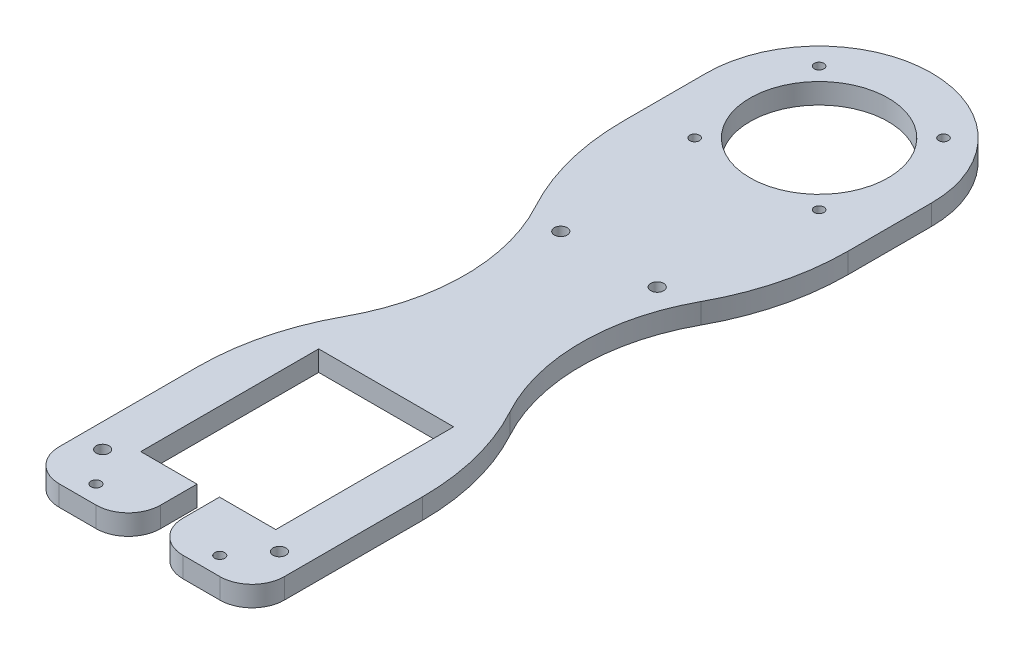
ISO-10303-21;
HEADER;
FILE_DESCRIPTION(('STEP AP214'),'2;1');
FILE_NAME('part.step','',(''),(''),'','','');
FILE_SCHEMA(('AUTOMOTIVE_DESIGN { 1 0 10303 214 1 1 1 1 }'));
ENDSEC;
DATA;
#1=APPLICATION_CONTEXT('core data for automotive mechanical design processes');
#2=APPLICATION_PROTOCOL_DEFINITION('international standard','automotive_design',2000,#1);
#3=PRODUCT_CONTEXT('',#1,'mechanical');
#4=PRODUCT('Part','Part','',(#3));
#5=PRODUCT_RELATED_PRODUCT_CATEGORY('part','',(#4));
#6=PRODUCT_DEFINITION_FORMATION('','',#4);
#7=PRODUCT_DEFINITION_CONTEXT('part definition',#1,'design');
#8=PRODUCT_DEFINITION('design','',#6,#7);
#9=PRODUCT_DEFINITION_SHAPE('','',#8);
#10=(LENGTH_UNIT() NAMED_UNIT(*) SI_UNIT(.MILLI.,.METRE.));
#11=(NAMED_UNIT(*) PLANE_ANGLE_UNIT() SI_UNIT($,.RADIAN.));
#12=(NAMED_UNIT(*) SI_UNIT($,.STERADIAN.) SOLID_ANGLE_UNIT());
#13=UNCERTAINTY_MEASURE_WITH_UNIT(LENGTH_MEASURE(1.E-05),#10,'distance_accuracy_value','');
#14=(GEOMETRIC_REPRESENTATION_CONTEXT(3) GLOBAL_UNCERTAINTY_ASSIGNED_CONTEXT((#13)) GLOBAL_UNIT_ASSIGNED_CONTEXT((#10,
#11,#12)) REPRESENTATION_CONTEXT('',''));
#15=CARTESIAN_POINT('',(0.,0.,0.));
#16=DIRECTION('',(0.,0.,1.));
#17=DIRECTION('',(1.,0.,0.));
#18=AXIS2_PLACEMENT_3D('',#15,#16,#17);
#19=CARTESIAN_POINT('',(35.,3.175,0.));
#20=DIRECTION('',(-1.,0.,0.));
#21=DIRECTION('',(0.,0.,1.));
#22=AXIS2_PLACEMENT_3D('',#19,#20,#21);
#23=PLANE('',#22);
#24=DIRECTION('',(0.,0.,-1.));
#25=VECTOR('',#24,1.);
#26=CARTESIAN_POINT('',(35.,3.175,0.));
#27=LINE('',#26,#25);
#28=CARTESIAN_POINT('',(35.,3.175,26.0091806341473));
#29=VERTEX_POINT('',#28);
#30=CARTESIAN_POINT('',(35.,3.175,0.));
#31=VERTEX_POINT('',#30);
#32=EDGE_CURVE('E316',#29,#31,#27,.T.);
#33=ORIENTED_EDGE('',*,*,#32,.F.);
#34=DIRECTION('',(0.,1.,0.));
#35=VECTOR('',#34,1.);
#36=CARTESIAN_POINT('',(35.,-3.175,26.0091806341473));
#37=LINE('',#36,#35);
#38=CARTESIAN_POINT('',(35.,-3.175,26.0091806341473));
#39=VERTEX_POINT('',#38);
#40=EDGE_CURVE('E395',#29,#39,#37,.F.);
#41=ORIENTED_EDGE('',*,*,#40,.T.);
#42=DIRECTION('',(0.,0.,-1.));
#43=VECTOR('',#42,1.);
#44=CARTESIAN_POINT('',(35.,-3.175,0.));
#45=LINE('',#44,#43);
#46=CARTESIAN_POINT('',(35.,-3.175,0.));
#47=VERTEX_POINT('',#46);
#48=EDGE_CURVE('E333',#39,#47,#45,.T.);
#49=ORIENTED_EDGE('',*,*,#48,.T.);
#50=DIRECTION('',(0.,-1.,0.));
#51=VECTOR('',#50,1.);
#52=CARTESIAN_POINT('',(35.,3.175,0.));
#53=LINE('',#52,#51);
#54=EDGE_CURVE('E315',#31,#47,#53,.T.);
#55=ORIENTED_EDGE('',*,*,#54,.F.);
#56=EDGE_LOOP('',(#33,#41,#49,#55));
#57=FACE_BOUND('',#56,.T.);
#58=ADVANCED_FACE('F41',(#57),#23,.F.);
#59=CARTESIAN_POINT('',(35.,-3.175,201.35));
#60=VERTEX_POINT('',#59);
#61=CARTESIAN_POINT('',(35.,-3.175,158.290819365853));
#62=VERTEX_POINT('',#61);
#63=EDGE_CURVE('E301',#60,#62,#45,.T.);
#64=ORIENTED_EDGE('',*,*,#63,.T.);
#65=DIRECTION('',(0.,1.,0.));
#66=VECTOR('',#65,1.);
#67=CARTESIAN_POINT('',(35.,3.175,158.290819365853));
#68=LINE('',#67,#66);
#69=CARTESIAN_POINT('',(35.,3.175,158.290819365853));
#70=VERTEX_POINT('',#69);
#71=EDGE_CURVE('E429',#62,#70,#68,.T.);
#72=ORIENTED_EDGE('',*,*,#71,.T.);
#73=CARTESIAN_POINT('',(35.,3.175,201.35));
#74=VERTEX_POINT('',#73);
#75=EDGE_CURVE('E311',#74,#70,#27,.T.);
#76=ORIENTED_EDGE('',*,*,#75,.F.);
#77=DIRECTION('',(0.,-1.,0.));
#78=VECTOR('',#77,1.);
#79=CARTESIAN_POINT('',(35.,3.175,201.35));
#80=LINE('',#79,#78);
#81=EDGE_CURVE('E391',#74,#60,#80,.T.);
#82=ORIENTED_EDGE('',*,*,#81,.T.);
#83=EDGE_LOOP('',(#64,#72,#76,#82));
#84=FACE_BOUND('',#83,.T.);
#85=ADVANCED_FACE('F532',(#84),#23,.F.);
#86=CARTESIAN_POINT('',(0.,3.175,0.));
#87=DIRECTION('',(0.,1.,0.));
#88=DIRECTION('',(0.,0.,1.));
#89=AXIS2_PLACEMENT_3D('',#86,#87,#88);
#90=PLANE('',#89);
#91=CARTESIAN_POINT('',(-19.25,3.175,205.675));
#92=DIRECTION('',(0.,-1.,0.));
#93=DIRECTION('',(0.,0.,-1.));
#94=AXIS2_PLACEMENT_3D('',#91,#92,#93);
#95=CIRCLE('',#94,1.55);
#96=CARTESIAN_POINT('',(-19.25,3.175,204.125));
#97=VERTEX_POINT('',#96);
#98=EDGE_CURVE('E660',#97,#97,#95,.T.);
#99=ORIENTED_EDGE('',*,*,#98,.T.);
#100=EDGE_LOOP('',(#99));
#101=FACE_BOUND('',#100,.T.);
#102=CARTESIAN_POINT('',(19.25,3.175,205.675));
#103=DIRECTION('',(0.,-1.,0.));
#104=DIRECTION('',(0.,0.,-1.));
#105=AXIS2_PLACEMENT_3D('',#102,#103,#104);
#106=CIRCLE('',#105,1.55);
#107=CARTESIAN_POINT('',(19.25,3.175,204.125));
#108=VERTEX_POINT('',#107);
#109=EDGE_CURVE('E670',#108,#108,#106,.T.);
#110=ORIENTED_EDGE('',*,*,#109,.T.);
#111=EDGE_LOOP('',(#110));
#112=FACE_BOUND('',#111,.T.);
#113=CARTESIAN_POINT('',(27.5,3.175,195.35));
#114=DIRECTION('',(0.,1.,0.));
#115=DIRECTION('',(0.,0.,1.));
#116=AXIS2_PLACEMENT_3D('',#113,#114,#115);
#117=CIRCLE('',#116,2.00000000000001);
#118=CARTESIAN_POINT('',(27.5,3.175,197.35));
#119=VERTEX_POINT('',#118);
#120=EDGE_CURVE('E459',#119,#119,#117,.T.);
#121=ORIENTED_EDGE('',*,*,#120,.F.);
#122=EDGE_LOOP('',(#121));
#123=FACE_BOUND('',#122,.T.);
#124=CARTESIAN_POINT('',(-27.5,3.175,195.35));
#125=DIRECTION('',(0.,1.,0.));
#126=DIRECTION('',(0.,0.,1.));
#127=AXIS2_PLACEMENT_3D('',#124,#125,#126);
#128=CIRCLE('',#127,2.00000000000001);
#129=CARTESIAN_POINT('',(-27.5,3.175,197.35));
#130=VERTEX_POINT('',#129);
#131=EDGE_CURVE('E479',#130,#130,#128,.T.);
#132=ORIENTED_EDGE('',*,*,#131,.F.);
#133=EDGE_LOOP('',(#132));
#134=FACE_BOUND('',#133,.T.);
#135=CARTESIAN_POINT('',(15.,3.175,65.35));
#136=DIRECTION('',(0.,1.,0.));
#137=DIRECTION('',(0.,0.,1.));
#138=AXIS2_PLACEMENT_3D('',#135,#136,#137);
#139=CIRCLE('',#138,2.00000000000001);
#140=CARTESIAN_POINT('',(15.,3.175,67.35));
#141=VERTEX_POINT('',#140);
#142=EDGE_CURVE('E471',#141,#141,#139,.T.);
#143=ORIENTED_EDGE('',*,*,#142,.F.);
#144=EDGE_LOOP('',(#143));
#145=FACE_BOUND('',#144,.T.);
#146=CARTESIAN_POINT('',(-15.,3.175,65.35));
#147=DIRECTION('',(0.,1.,0.));
#148=DIRECTION('',(0.,0.,1.));
#149=AXIS2_PLACEMENT_3D('',#146,#147,#148);
#150=CIRCLE('',#149,2.00000000000001);
#151=CARTESIAN_POINT('',(-15.,3.175,67.35));
#152=VERTEX_POINT('',#151);
#153=EDGE_CURVE('E470',#152,#152,#150,.T.);
#154=ORIENTED_EDGE('',*,*,#153,.F.);
#155=EDGE_LOOP('',(#154));
#156=FACE_BOUND('',#155,.T.);
#157=CARTESIAN_POINT('',(-19.35,3.175,19.35));
#158=DIRECTION('',(0.,1.,0.));
#159=DIRECTION('',(0.,0.,1.));
#160=AXIS2_PLACEMENT_3D('',#157,#158,#159);
#161=CIRCLE('',#160,1.5);
#162=CARTESIAN_POINT('',(-19.35,3.175,20.85));
#163=VERTEX_POINT('',#162);
#164=EDGE_CURVE('E494',#163,#163,#161,.T.);
#165=ORIENTED_EDGE('',*,*,#164,.F.);
#166=EDGE_LOOP('',(#165));
#167=FACE_BOUND('',#166,.T.);
#168=CARTESIAN_POINT('',(19.35,3.175,19.35));
#169=DIRECTION('',(0.,1.,0.));
#170=DIRECTION('',(0.,0.,1.));
#171=AXIS2_PLACEMENT_3D('',#168,#169,#170);
#172=CIRCLE('',#171,1.5);
#173=CARTESIAN_POINT('',(19.35,3.175,20.85));
#174=VERTEX_POINT('',#173);
#175=EDGE_CURVE('E510',#174,#174,#172,.T.);
#176=ORIENTED_EDGE('',*,*,#175,.F.);
#177=EDGE_LOOP('',(#176));
#178=FACE_BOUND('',#177,.T.);
#179=CARTESIAN_POINT('',(19.35,3.175,-19.35));
#180=DIRECTION('',(0.,1.,0.));
#181=DIRECTION('',(0.,0.,1.));
#182=AXIS2_PLACEMENT_3D('',#179,#180,#181);
#183=CIRCLE('',#182,1.5);
#184=CARTESIAN_POINT('',(19.35,3.175,-17.85));
#185=VERTEX_POINT('',#184);
#186=EDGE_CURVE('E502',#185,#185,#183,.T.);
#187=ORIENTED_EDGE('',*,*,#186,.F.);
#188=EDGE_LOOP('',(#187));
#189=FACE_BOUND('',#188,.T.);
#190=CARTESIAN_POINT('',(-19.35,3.175,-19.35));
#191=DIRECTION('',(0.,1.,0.));
#192=DIRECTION('',(0.,0.,1.));
#193=AXIS2_PLACEMENT_3D('',#190,#191,#192);
#194=CIRCLE('',#193,1.5);
#195=CARTESIAN_POINT('',(-19.35,3.175,-17.85));
#196=VERTEX_POINT('',#195);
#197=EDGE_CURVE('E243',#196,#196,#194,.T.);
#198=ORIENTED_EDGE('',*,*,#197,.F.);
#199=EDGE_LOOP('',(#198));
#200=FACE_BOUND('',#199,.T.);
#201=CARTESIAN_POINT('',(0.,3.175,0.));
#202=DIRECTION('',(0.,1.,0.));
#203=DIRECTION('',(0.,0.,1.));
#204=AXIS2_PLACEMENT_3D('',#201,#202,#203);
#205=CIRCLE('',#204,21.5);
#206=CARTESIAN_POINT('',(0.,3.175,21.5));
#207=VERTEX_POINT('',#206);
#208=EDGE_CURVE('E275',#207,#207,#205,.T.);
#209=ORIENTED_EDGE('',*,*,#208,.F.);
#210=EDGE_LOOP('',(#209));
#211=FACE_BOUND('',#210,.T.);
#212=CARTESIAN_POINT('',(80.,3.175,92.15));
#213=DIRECTION('',(0.,1.,0.));
#214=DIRECTION('',(0.,0.,-1.));
#215=AXIS2_PLACEMENT_3D('',#212,#213,#214);
#216=CIRCLE('',#215,61.8970920156997);
#217=CARTESIAN_POINT('',(25.6874106304796,3.175,62.4617424563539));
#218=VERTEX_POINT('',#217);
#219=CARTESIAN_POINT('',(25.6874106304796,3.175,121.838257543646));
#220=VERTEX_POINT('',#219);
#221=EDGE_CURVE('E455',#218,#220,#216,.T.);
#222=ORIENTED_EDGE('',*,*,#221,.F.);
#223=CARTESIAN_POINT('',(-41.,3.175,26.0091806341473));
#224=DIRECTION('',(0.,1.,0.));
#225=DIRECTION('',(0.,0.,1.));
#226=AXIS2_PLACEMENT_3D('',#223,#224,#225);
#227=CIRCLE('',#226,76.);
#228=EDGE_CURVE('E426',#218,#29,#227,.T.);
#229=ORIENTED_EDGE('',*,*,#228,.T.);
#230=ORIENTED_EDGE('',*,*,#32,.T.);
#231=CARTESIAN_POINT('',(0.,3.175,0.));
#232=DIRECTION('',(0.,1.,0.));
#233=DIRECTION('',(0.,0.,1.));
#234=AXIS2_PLACEMENT_3D('',#231,#232,#233);
#235=CIRCLE('',#234,35.);
#236=CARTESIAN_POINT('',(-35.,3.175,0.));
#237=VERTEX_POINT('',#236);
#238=EDGE_CURVE('E296',#31,#237,#235,.T.);
#239=ORIENTED_EDGE('',*,*,#238,.T.);
#240=DIRECTION('',(0.,0.,1.));
#241=VECTOR('',#240,1.);
#242=CARTESIAN_POINT('',(-35.,3.175,0.));
#243=LINE('',#242,#241);
#244=CARTESIAN_POINT('',(-35.,3.175,26.0091806341473));
#245=VERTEX_POINT('',#244);
#246=EDGE_CURVE('E302',#237,#245,#243,.T.);
#247=ORIENTED_EDGE('',*,*,#246,.T.);
#248=CARTESIAN_POINT('',(41.,3.175,26.0091806341473));
#249=DIRECTION('',(0.,1.,0.));
#250=DIRECTION('',(0.,0.,1.));
#251=AXIS2_PLACEMENT_3D('',#248,#249,#250);
#252=CIRCLE('',#251,76.);
#253=CARTESIAN_POINT('',(-25.6874106304796,3.175,62.4617424563539));
#254=VERTEX_POINT('',#253);
#255=EDGE_CURVE('E420',#245,#254,#252,.T.);
#256=ORIENTED_EDGE('',*,*,#255,.T.);
#257=CARTESIAN_POINT('',(-80.,3.175,92.15));
#258=DIRECTION('',(0.,-1.,0.));
#259=DIRECTION('',(0.,0.,-1.));
#260=AXIS2_PLACEMENT_3D('',#257,#258,#259);
#261=CIRCLE('',#260,61.8970920156997);
#262=CARTESIAN_POINT('',(-25.6874106304796,3.175,121.838257543646));
#263=VERTEX_POINT('',#262);
#264=EDGE_CURVE('E452',#254,#263,#261,.T.);
#265=ORIENTED_EDGE('',*,*,#264,.T.);
#266=CARTESIAN_POINT('',(41.,3.175,158.290819365853));
#267=DIRECTION('',(0.,1.,0.));
#268=DIRECTION('',(0.,0.,1.));
#269=AXIS2_PLACEMENT_3D('',#266,#267,#268);
#270=CIRCLE('',#269,76.);
#271=CARTESIAN_POINT('',(-35.,3.175,158.290819365853));
#272=VERTEX_POINT('',#271);
#273=EDGE_CURVE('E57',#263,#272,#270,.T.);
#274=ORIENTED_EDGE('',*,*,#273,.T.);
#275=CARTESIAN_POINT('',(-35.,3.175,201.35));
#276=VERTEX_POINT('',#275);
#277=EDGE_CURVE('E300',#272,#276,#243,.T.);
#278=ORIENTED_EDGE('',*,*,#277,.T.);
#279=CARTESIAN_POINT('',(-25.,3.175,201.35));
#280=DIRECTION('',(0.,1.,0.));
#281=DIRECTION('',(0.,0.,1.));
#282=AXIS2_PLACEMENT_3D('',#279,#280,#281);
#283=CIRCLE('',#282,10.);
#284=CARTESIAN_POINT('',(-25.,3.175,211.35));
#285=VERTEX_POINT('',#284);
#286=EDGE_CURVE('E352',#276,#285,#283,.T.);
#287=ORIENTED_EDGE('',*,*,#286,.T.);
#288=DIRECTION('',(1.,0.,0.));
#289=VECTOR('',#288,1.);
#290=CARTESIAN_POINT('',(0.,3.175,211.35));
#291=LINE('',#290,#289);
#292=CARTESIAN_POINT('',(-13.5,3.175,211.35));
#293=VERTEX_POINT('',#292);
#294=EDGE_CURVE('E310',#285,#293,#291,.T.);
#295=ORIENTED_EDGE('',*,*,#294,.T.);
#296=CARTESIAN_POINT('',(-13.5,3.175,201.35));
#297=DIRECTION('',(0.,1.,0.));
#298=DIRECTION('',(0.,0.,1.));
#299=AXIS2_PLACEMENT_3D('',#296,#297,#298);
#300=CIRCLE('',#299,10.);
#301=CARTESIAN_POINT('',(-3.5,3.175,201.35));
#302=VERTEX_POINT('',#301);
#303=EDGE_CURVE('E358',#293,#302,#300,.T.);
#304=ORIENTED_EDGE('',*,*,#303,.T.);
#305=DIRECTION('',(0.,0.,-1.));
#306=VECTOR('',#305,1.);
#307=CARTESIAN_POINT('',(-3.5,3.175,0.));
#308=LINE('',#307,#306);
#309=CARTESIAN_POINT('',(-3.5,3.175,190.));
#310=VERTEX_POINT('',#309);
#311=EDGE_CURVE('E262',#302,#310,#308,.T.);
#312=ORIENTED_EDGE('',*,*,#311,.T.);
#313=DIRECTION('',(-1.,0.,0.));
#314=VECTOR('',#313,1.);
#315=CARTESIAN_POINT('',(0.,3.175,190.));
#316=LINE('',#315,#314);
#317=CARTESIAN_POINT('',(-21.,3.175,190.));
#318=VERTEX_POINT('',#317);
#319=EDGE_CURVE('E258',#310,#318,#316,.T.);
#320=ORIENTED_EDGE('',*,*,#319,.T.);
#321=DIRECTION('',(0.,0.,-1.));
#322=VECTOR('',#321,1.);
#323=CARTESIAN_POINT('',(-21.,3.175,0.));
#324=LINE('',#323,#322);
#325=CARTESIAN_POINT('',(-21.,3.175,134.65));
#326=VERTEX_POINT('',#325);
#327=EDGE_CURVE('E225',#318,#326,#324,.T.);
#328=ORIENTED_EDGE('',*,*,#327,.T.);
#329=DIRECTION('',(-1.,0.,0.));
#330=VECTOR('',#329,1.);
#331=CARTESIAN_POINT('',(0.,3.175,134.65));
#332=LINE('',#331,#330);
#333=CARTESIAN_POINT('',(21.,3.175,134.65));
#334=VERTEX_POINT('',#333);
#335=EDGE_CURVE('E236',#334,#326,#332,.T.);
#336=ORIENTED_EDGE('',*,*,#335,.F.);
#337=DIRECTION('',(0.,0.,-1.));
#338=VECTOR('',#337,1.);
#339=CARTESIAN_POINT('',(21.,3.175,0.));
#340=LINE('',#339,#338);
#341=CARTESIAN_POINT('',(21.,3.175,190.));
#342=VERTEX_POINT('',#341);
#343=EDGE_CURVE('E240',#342,#334,#340,.T.);
#344=ORIENTED_EDGE('',*,*,#343,.F.);
#345=CARTESIAN_POINT('',(3.5,3.175,190.));
#346=VERTEX_POINT('',#345);
#347=EDGE_CURVE('E263',#342,#346,#316,.T.);
#348=ORIENTED_EDGE('',*,*,#347,.T.);
#349=DIRECTION('',(0.,0.,-1.));
#350=VECTOR('',#349,1.);
#351=CARTESIAN_POINT('',(3.5,3.175,0.));
#352=LINE('',#351,#350);
#353=CARTESIAN_POINT('',(3.5,3.175,201.35));
#354=VERTEX_POINT('',#353);
#355=EDGE_CURVE('E266',#354,#346,#352,.T.);
#356=ORIENTED_EDGE('',*,*,#355,.F.);
#357=CARTESIAN_POINT('',(13.5,3.175,201.35));
#358=DIRECTION('',(0.,1.,0.));
#359=DIRECTION('',(0.,0.,1.));
#360=AXIS2_PLACEMENT_3D('',#357,#358,#359);
#361=CIRCLE('',#360,10.);
#362=CARTESIAN_POINT('',(13.5,3.175,211.35));
#363=VERTEX_POINT('',#362);
#364=EDGE_CURVE('E355',#354,#363,#361,.T.);
#365=ORIENTED_EDGE('',*,*,#364,.T.);
#366=CARTESIAN_POINT('',(25.,3.175,211.35));
#367=VERTEX_POINT('',#366);
#368=EDGE_CURVE('E306',#363,#367,#291,.T.);
#369=ORIENTED_EDGE('',*,*,#368,.T.);
#370=CARTESIAN_POINT('',(25.,3.175,201.35));
#371=DIRECTION('',(0.,1.,0.));
#372=DIRECTION('',(0.,0.,1.));
#373=AXIS2_PLACEMENT_3D('',#370,#371,#372);
#374=CIRCLE('',#373,10.);
#375=EDGE_CURVE('E349',#367,#74,#374,.T.);
#376=ORIENTED_EDGE('',*,*,#375,.T.);
#377=ORIENTED_EDGE('',*,*,#75,.T.);
#378=CARTESIAN_POINT('',(-41.,3.175,158.290819365853));
#379=DIRECTION('',(0.,1.,0.));
#380=DIRECTION('',(0.,0.,1.));
#381=AXIS2_PLACEMENT_3D('',#378,#379,#380);
#382=CIRCLE('',#381,76.);
#383=EDGE_CURVE('E423',#70,#220,#382,.T.);
#384=ORIENTED_EDGE('',*,*,#383,.T.);
#385=EDGE_LOOP('',(#222,#229,#230,#239,#247,#256,#265,#274,#278,#287,#295,#304,#312,#320,#328,
#336,#344,#348,#356,#365,#369,#376,#377,#384));
#386=FACE_BOUND('',#385,.T.);
#387=ADVANCED_FACE('F444',(#101,#112,#123,#134,#145,#156,#167,#178,#189,#200,#211,#386),#90,.T.);
#388=CARTESIAN_POINT('',(0.,-3.175,0.));
#389=DIRECTION('',(0.,1.,0.));
#390=DIRECTION('',(0.,0.,1.));
#391=AXIS2_PLACEMENT_3D('',#388,#389,#390);
#392=PLANE('',#391);
#393=CARTESIAN_POINT('',(-19.25,-3.175,205.675));
#394=DIRECTION('',(0.,-1.,0.));
#395=DIRECTION('',(0.,0.,-1.));
#396=AXIS2_PLACEMENT_3D('',#393,#394,#395);
#397=CIRCLE('',#396,1.55);
#398=CARTESIAN_POINT('',(-19.25,-3.175,204.125));
#399=VERTEX_POINT('',#398);
#400=EDGE_CURVE('E663',#399,#399,#397,.T.);
#401=ORIENTED_EDGE('',*,*,#400,.F.);
#402=EDGE_LOOP('',(#401));
#403=FACE_BOUND('',#402,.T.);
#404=CARTESIAN_POINT('',(19.25,-3.175,205.675));
#405=DIRECTION('',(0.,-1.,0.));
#406=DIRECTION('',(0.,0.,-1.));
#407=AXIS2_PLACEMENT_3D('',#404,#405,#406);
#408=CIRCLE('',#407,1.55);
#409=CARTESIAN_POINT('',(19.25,-3.175,204.125));
#410=VERTEX_POINT('',#409);
#411=EDGE_CURVE('E666',#410,#410,#408,.T.);
#412=ORIENTED_EDGE('',*,*,#411,.F.);
#413=EDGE_LOOP('',(#412));
#414=FACE_BOUND('',#413,.T.);
#415=CARTESIAN_POINT('',(0.,-3.175,0.));
#416=DIRECTION('',(0.,1.,0.));
#417=DIRECTION('',(0.,0.,1.));
#418=AXIS2_PLACEMENT_3D('',#415,#416,#417);
#419=CIRCLE('',#418,21.5);
#420=CARTESIAN_POINT('',(0.,-3.175,21.5));
#421=VERTEX_POINT('',#420);
#422=EDGE_CURVE('E288',#421,#421,#419,.T.);
#423=ORIENTED_EDGE('',*,*,#422,.T.);
#424=EDGE_LOOP('',(#423));
#425=FACE_BOUND('',#424,.T.);
#426=CARTESIAN_POINT('',(-19.35,-3.175,-19.35));
#427=DIRECTION('',(0.,1.,0.));
#428=DIRECTION('',(0.,0.,1.));
#429=AXIS2_PLACEMENT_3D('',#426,#427,#428);
#430=CIRCLE('',#429,1.5);
#431=CARTESIAN_POINT('',(-19.35,-3.175,-17.85));
#432=VERTEX_POINT('',#431);
#433=EDGE_CURVE('E259',#432,#432,#430,.T.);
#434=ORIENTED_EDGE('',*,*,#433,.T.);
#435=EDGE_LOOP('',(#434));
#436=FACE_BOUND('',#435,.T.);
#437=CARTESIAN_POINT('',(19.35,-3.175,-19.35));
#438=DIRECTION('',(0.,1.,0.));
#439=DIRECTION('',(0.,0.,1.));
#440=AXIS2_PLACEMENT_3D('',#437,#438,#439);
#441=CIRCLE('',#440,1.5);
#442=CARTESIAN_POINT('',(19.35,-3.175,-17.85));
#443=VERTEX_POINT('',#442);
#444=EDGE_CURVE('E498',#443,#443,#441,.T.);
#445=ORIENTED_EDGE('',*,*,#444,.T.);
#446=EDGE_LOOP('',(#445));
#447=FACE_BOUND('',#446,.T.);
#448=CARTESIAN_POINT('',(19.35,-3.175,19.35));
#449=DIRECTION('',(0.,1.,0.));
#450=DIRECTION('',(0.,0.,1.));
#451=AXIS2_PLACEMENT_3D('',#448,#449,#450);
#452=CIRCLE('',#451,1.5);
#453=CARTESIAN_POINT('',(19.35,-3.175,20.85));
#454=VERTEX_POINT('',#453);
#455=EDGE_CURVE('E506',#454,#454,#452,.T.);
#456=ORIENTED_EDGE('',*,*,#455,.T.);
#457=EDGE_LOOP('',(#456));
#458=FACE_BOUND('',#457,.T.);
#459=CARTESIAN_POINT('',(-19.35,-3.175,19.35));
#460=DIRECTION('',(0.,1.,0.));
#461=DIRECTION('',(0.,0.,1.));
#462=AXIS2_PLACEMENT_3D('',#459,#460,#461);
#463=CIRCLE('',#462,1.5);
#464=CARTESIAN_POINT('',(-19.35,-3.175,20.85));
#465=VERTEX_POINT('',#464);
#466=EDGE_CURVE('E514',#465,#465,#463,.T.);
#467=ORIENTED_EDGE('',*,*,#466,.T.);
#468=EDGE_LOOP('',(#467));
#469=FACE_BOUND('',#468,.T.);
#470=CARTESIAN_POINT('',(-15.,-3.175,65.35));
#471=DIRECTION('',(0.,1.,0.));
#472=DIRECTION('',(0.,0.,1.));
#473=AXIS2_PLACEMENT_3D('',#470,#471,#472);
#474=CIRCLE('',#473,2.00000000000001);
#475=CARTESIAN_POINT('',(-15.,-3.175,67.35));
#476=VERTEX_POINT('',#475);
#477=EDGE_CURVE('E490',#476,#476,#474,.T.);
#478=ORIENTED_EDGE('',*,*,#477,.T.);
#479=EDGE_LOOP('',(#478));
#480=FACE_BOUND('',#479,.T.);
#481=CARTESIAN_POINT('',(15.,-3.175,65.35));
#482=DIRECTION('',(0.,1.,0.));
#483=DIRECTION('',(0.,0.,1.));
#484=AXIS2_PLACEMENT_3D('',#481,#482,#483);
#485=CIRCLE('',#484,2.00000000000001);
#486=CARTESIAN_POINT('',(15.,-3.175,67.35));
#487=VERTEX_POINT('',#486);
#488=EDGE_CURVE('E466',#487,#487,#485,.T.);
#489=ORIENTED_EDGE('',*,*,#488,.T.);
#490=EDGE_LOOP('',(#489));
#491=FACE_BOUND('',#490,.T.);
#492=CARTESIAN_POINT('',(-27.5,-3.175,195.35));
#493=DIRECTION('',(0.,1.,0.));
#494=DIRECTION('',(0.,0.,1.));
#495=AXIS2_PLACEMENT_3D('',#492,#493,#494);
#496=CIRCLE('',#495,2.00000000000001);
#497=CARTESIAN_POINT('',(-27.5,-3.175,197.35));
#498=VERTEX_POINT('',#497);
#499=EDGE_CURVE('E475',#498,#498,#496,.T.);
#500=ORIENTED_EDGE('',*,*,#499,.T.);
#501=EDGE_LOOP('',(#500));
#502=FACE_BOUND('',#501,.T.);
#503=CARTESIAN_POINT('',(27.5,-3.175,195.35));
#504=DIRECTION('',(0.,1.,0.));
#505=DIRECTION('',(0.,0.,1.));
#506=AXIS2_PLACEMENT_3D('',#503,#504,#505);
#507=CIRCLE('',#506,2.00000000000001);
#508=CARTESIAN_POINT('',(27.5,-3.175,197.35));
#509=VERTEX_POINT('',#508);
#510=EDGE_CURVE('E483',#509,#509,#507,.T.);
#511=ORIENTED_EDGE('',*,*,#510,.T.);
#512=EDGE_LOOP('',(#511));
#513=FACE_BOUND('',#512,.T.);
#514=ORIENTED_EDGE('',*,*,#48,.F.);
#515=CARTESIAN_POINT('',(-41.,-3.175,26.0091806341473));
#516=DIRECTION('',(0.,1.,0.));
#517=DIRECTION('',(0.,0.,1.));
#518=AXIS2_PLACEMENT_3D('',#515,#516,#517);
#519=CIRCLE('',#518,76.);
#520=CARTESIAN_POINT('',(25.6874106304796,-3.175,62.4617424563539));
#521=VERTEX_POINT('',#520);
#522=EDGE_CURVE('E408',#39,#521,#519,.F.);
#523=ORIENTED_EDGE('',*,*,#522,.T.);
#524=CARTESIAN_POINT('',(80.,-3.175,92.15));
#525=DIRECTION('',(0.,1.,0.));
#526=DIRECTION('',(0.,0.,-1.));
#527=AXIS2_PLACEMENT_3D('',#524,#525,#526);
#528=CIRCLE('',#527,61.8970920156997);
#529=CARTESIAN_POINT('',(25.6874106304796,-3.175,121.838257543646));
#530=VERTEX_POINT('',#529);
#531=EDGE_CURVE('E462',#521,#530,#528,.T.);
#532=ORIENTED_EDGE('',*,*,#531,.T.);
#533=CARTESIAN_POINT('',(-41.,-3.175,158.290819365853));
#534=DIRECTION('',(0.,1.,0.));
#535=DIRECTION('',(0.,0.,1.));
#536=AXIS2_PLACEMENT_3D('',#533,#534,#535);
#537=CIRCLE('',#536,76.);
#538=EDGE_CURVE('E405',#530,#62,#537,.F.);
#539=ORIENTED_EDGE('',*,*,#538,.T.);
#540=ORIENTED_EDGE('',*,*,#63,.F.);
#541=CARTESIAN_POINT('',(25.,-3.175,201.35));
#542=DIRECTION('',(0.,1.,0.));
#543=DIRECTION('',(0.,0.,1.));
#544=AXIS2_PLACEMENT_3D('',#541,#542,#543);
#545=CIRCLE('',#544,10.);
#546=CARTESIAN_POINT('',(25.,-3.175,211.35));
#547=VERTEX_POINT('',#546);
#548=EDGE_CURVE('E364',#60,#547,#545,.F.);
#549=ORIENTED_EDGE('',*,*,#548,.T.);
#550=DIRECTION('',(1.,0.,0.));
#551=VECTOR('',#550,1.);
#552=CARTESIAN_POINT('',(0.,-3.175,211.35));
#553=LINE('',#552,#551);
#554=CARTESIAN_POINT('',(13.5,-3.175,211.35));
#555=VERTEX_POINT('',#554);
#556=EDGE_CURVE('E325',#555,#547,#553,.T.);
#557=ORIENTED_EDGE('',*,*,#556,.F.);
#558=CARTESIAN_POINT('',(13.5,-3.175,201.35));
#559=DIRECTION('',(0.,1.,0.));
#560=DIRECTION('',(0.,0.,1.));
#561=AXIS2_PLACEMENT_3D('',#558,#559,#560);
#562=CIRCLE('',#561,10.);
#563=CARTESIAN_POINT('',(3.5,-3.175,201.35));
#564=VERTEX_POINT('',#563);
#565=EDGE_CURVE('E371',#555,#564,#562,.F.);
#566=ORIENTED_EDGE('',*,*,#565,.T.);
#567=DIRECTION('',(0.,0.,-1.));
#568=VECTOR('',#567,1.);
#569=CARTESIAN_POINT('',(3.5,-3.175,0.));
#570=LINE('',#569,#568);
#571=CARTESIAN_POINT('',(3.5,-3.175,190.));
#572=VERTEX_POINT('',#571);
#573=EDGE_CURVE('E248',#564,#572,#570,.T.);
#574=ORIENTED_EDGE('',*,*,#573,.T.);
#575=DIRECTION('',(-1.,0.,0.));
#576=VECTOR('',#575,1.);
#577=CARTESIAN_POINT('',(0.,-3.175,190.));
#578=LINE('',#577,#576);
#579=CARTESIAN_POINT('',(21.,-3.175,190.));
#580=VERTEX_POINT('',#579);
#581=EDGE_CURVE('E220',#580,#572,#578,.T.);
#582=ORIENTED_EDGE('',*,*,#581,.F.);
#583=DIRECTION('',(0.,0.,-1.));
#584=VECTOR('',#583,1.);
#585=CARTESIAN_POINT('',(21.,-3.175,0.));
#586=LINE('',#585,#584);
#587=CARTESIAN_POINT('',(21.,-3.175,134.65));
#588=VERTEX_POINT('',#587);
#589=EDGE_CURVE('E251',#580,#588,#586,.T.);
#590=ORIENTED_EDGE('',*,*,#589,.T.);
#591=DIRECTION('',(-1.,0.,0.));
#592=VECTOR('',#591,1.);
#593=CARTESIAN_POINT('',(0.,-3.175,134.65));
#594=LINE('',#593,#592);
#595=CARTESIAN_POINT('',(-21.,-3.175,134.65));
#596=VERTEX_POINT('',#595);
#597=EDGE_CURVE('E228',#588,#596,#594,.T.);
#598=ORIENTED_EDGE('',*,*,#597,.T.);
#599=DIRECTION('',(0.,0.,-1.));
#600=VECTOR('',#599,1.);
#601=CARTESIAN_POINT('',(-21.,-3.175,0.));
#602=LINE('',#601,#600);
#603=CARTESIAN_POINT('',(-21.,-3.175,190.));
#604=VERTEX_POINT('',#603);
#605=EDGE_CURVE('E218',#604,#596,#602,.T.);
#606=ORIENTED_EDGE('',*,*,#605,.F.);
#607=CARTESIAN_POINT('',(-3.5,-3.175,190.));
#608=VERTEX_POINT('',#607);
#609=EDGE_CURVE('E205',#608,#604,#578,.T.);
#610=ORIENTED_EDGE('',*,*,#609,.F.);
#611=DIRECTION('',(0.,0.,-1.));
#612=VECTOR('',#611,1.);
#613=CARTESIAN_POINT('',(-3.5,-3.175,0.));
#614=LINE('',#613,#612);
#615=CARTESIAN_POINT('',(-3.5,-3.175,201.35));
#616=VERTEX_POINT('',#615);
#617=EDGE_CURVE('E217',#616,#608,#614,.T.);
#618=ORIENTED_EDGE('',*,*,#617,.F.);
#619=CARTESIAN_POINT('',(-13.5,-3.175,201.35));
#620=DIRECTION('',(0.,1.,0.));
#621=DIRECTION('',(0.,0.,1.));
#622=AXIS2_PLACEMENT_3D('',#619,#620,#621);
#623=CIRCLE('',#622,10.);
#624=CARTESIAN_POINT('',(-13.5,-3.175,211.35));
#625=VERTEX_POINT('',#624);
#626=EDGE_CURVE('E374',#616,#625,#623,.F.);
#627=ORIENTED_EDGE('',*,*,#626,.T.);
#628=CARTESIAN_POINT('',(-25.,-3.175,211.35));
#629=VERTEX_POINT('',#628);
#630=EDGE_CURVE('E329',#629,#625,#553,.T.);
#631=ORIENTED_EDGE('',*,*,#630,.F.);
#632=CARTESIAN_POINT('',(-25.,-3.175,201.35));
#633=DIRECTION('',(0.,1.,0.));
#634=DIRECTION('',(0.,0.,1.));
#635=AXIS2_PLACEMENT_3D('',#632,#633,#634);
#636=CIRCLE('',#635,10.);
#637=CARTESIAN_POINT('',(-35.,-3.175,201.35));
#638=VERTEX_POINT('',#637);
#639=EDGE_CURVE('E367',#629,#638,#636,.F.);
#640=ORIENTED_EDGE('',*,*,#639,.T.);
#641=DIRECTION('',(0.,0.,1.));
#642=VECTOR('',#641,1.);
#643=CARTESIAN_POINT('',(-35.,-3.175,0.));
#644=LINE('',#643,#642);
#645=CARTESIAN_POINT('',(-35.,-3.175,158.290819365853));
#646=VERTEX_POINT('',#645);
#647=EDGE_CURVE('E320',#646,#638,#644,.T.);
#648=ORIENTED_EDGE('',*,*,#647,.F.);
#649=CARTESIAN_POINT('',(41.,-3.175,158.290819365853));
#650=DIRECTION('',(0.,1.,0.));
#651=DIRECTION('',(0.,0.,1.));
#652=AXIS2_PLACEMENT_3D('',#649,#650,#651);
#653=CIRCLE('',#652,76.);
#654=CARTESIAN_POINT('',(-25.6874106304796,-3.175,121.838257543646));
#655=VERTEX_POINT('',#654);
#656=EDGE_CURVE('E399',#646,#655,#653,.F.);
#657=ORIENTED_EDGE('',*,*,#656,.T.);
#658=CARTESIAN_POINT('',(-80.,-3.175,92.15));
#659=DIRECTION('',(0.,-1.,0.));
#660=DIRECTION('',(0.,0.,-1.));
#661=AXIS2_PLACEMENT_3D('',#658,#659,#660);
#662=CIRCLE('',#661,61.8970920156997);
#663=CARTESIAN_POINT('',(-25.6874106304796,-3.175,62.4617424563539));
#664=VERTEX_POINT('',#663);
#665=EDGE_CURVE('E451',#664,#655,#662,.T.);
#666=ORIENTED_EDGE('',*,*,#665,.F.);
#667=CARTESIAN_POINT('',(41.,-3.175,26.0091806341473));
#668=DIRECTION('',(0.,1.,0.));
#669=DIRECTION('',(0.,0.,1.));
#670=AXIS2_PLACEMENT_3D('',#667,#668,#669);
#671=CIRCLE('',#670,76.);
#672=CARTESIAN_POINT('',(-35.,-3.175,26.0091806341473));
#673=VERTEX_POINT('',#672);
#674=EDGE_CURVE('E402',#664,#673,#671,.F.);
#675=ORIENTED_EDGE('',*,*,#674,.T.);
#676=CARTESIAN_POINT('',(-35.,-3.175,0.));
#677=VERTEX_POINT('',#676);
#678=EDGE_CURVE('E321',#677,#673,#644,.T.);
#679=ORIENTED_EDGE('',*,*,#678,.F.);
#680=CARTESIAN_POINT('',(0.,-3.175,0.));
#681=DIRECTION('',(0.,1.,0.));
#682=DIRECTION('',(0.,0.,1.));
#683=AXIS2_PLACEMENT_3D('',#680,#681,#682);
#684=CIRCLE('',#683,35.);
#685=EDGE_CURVE('E292',#47,#677,#684,.T.);
#686=ORIENTED_EDGE('',*,*,#685,.F.);
#687=EDGE_LOOP('',(#514,#523,#532,#539,#540,#549,#557,#566,#574,#582,#590,#598,#606,#610,#618,
#627,#631,#640,#648,#657,#666,#675,#679,#686));
#688=FACE_BOUND('',#687,.T.);
#689=ADVANCED_FACE('F232',(#403,#414,#425,#436,#447,#458,#469,#480,#491,#502,#513,#688),#392,.F.);
#690=CARTESIAN_POINT('',(-35.,3.175,0.));
#691=DIRECTION('',(1.,0.,0.));
#692=DIRECTION('',(0.,0.,-1.));
#693=AXIS2_PLACEMENT_3D('',#690,#691,#692);
#694=PLANE('',#693);
#695=ORIENTED_EDGE('',*,*,#277,.F.);
#696=DIRECTION('',(0.,-1.,0.));
#697=VECTOR('',#696,1.);
#698=CARTESIAN_POINT('',(-35.,3.175,158.290819365853));
#699=LINE('',#698,#697);
#700=EDGE_CURVE('E11',#272,#646,#699,.T.);
#701=ORIENTED_EDGE('',*,*,#700,.T.);
#702=ORIENTED_EDGE('',*,*,#647,.T.);
#703=DIRECTION('',(0.,-1.,0.));
#704=VECTOR('',#703,1.);
#705=CARTESIAN_POINT('',(-35.,3.175,201.35));
#706=LINE('',#705,#704);
#707=EDGE_CURVE('E387',#638,#276,#706,.F.);
#708=ORIENTED_EDGE('',*,*,#707,.T.);
#709=EDGE_LOOP('',(#695,#701,#702,#708));
#710=FACE_BOUND('',#709,.T.);
#711=ADVANCED_FACE('F565',(#710),#694,.F.);
#712=CARTESIAN_POINT('',(0.,3.175,211.35));
#713=DIRECTION('',(0.,0.,-1.));
#714=DIRECTION('',(-1.,0.,0.));
#715=AXIS2_PLACEMENT_3D('',#712,#713,#714);
#716=PLANE('',#715);
#717=ORIENTED_EDGE('',*,*,#630,.T.);
#718=DIRECTION('',(0.,1.,0.));
#719=VECTOR('',#718,1.);
#720=CARTESIAN_POINT('',(-13.5,3.175,211.35));
#721=LINE('',#720,#719);
#722=EDGE_CURVE('E345',#625,#293,#721,.T.);
#723=ORIENTED_EDGE('',*,*,#722,.T.);
#724=ORIENTED_EDGE('',*,*,#294,.F.);
#725=DIRECTION('',(0.,-1.,0.));
#726=VECTOR('',#725,1.);
#727=CARTESIAN_POINT('',(-25.,3.175,211.35));
#728=LINE('',#727,#726);
#729=EDGE_CURVE('E341',#285,#629,#728,.T.);
#730=ORIENTED_EDGE('',*,*,#729,.T.);
#731=EDGE_LOOP('',(#717,#723,#724,#730));
#732=FACE_BOUND('',#731,.T.);
#733=ADVANCED_FACE('F550',(#732),#716,.F.);
#734=CARTESIAN_POINT('',(0.,3.175,0.));
#735=DIRECTION('',(0.,-1.,0.));
#736=DIRECTION('',(0.,0.,-1.));
#737=AXIS2_PLACEMENT_3D('',#734,#735,#736);
#738=CYLINDRICAL_SURFACE('',#737,35.);
#739=ORIENTED_EDGE('',*,*,#685,.T.);
#740=DIRECTION('',(0.,-1.,0.));
#741=VECTOR('',#740,1.);
#742=CARTESIAN_POINT('',(-35.,3.175,0.));
#743=LINE('',#742,#741);
#744=EDGE_CURVE('E337',#237,#677,#743,.T.);
#745=ORIENTED_EDGE('',*,*,#744,.F.);
#746=ORIENTED_EDGE('',*,*,#238,.F.);
#747=ORIENTED_EDGE('',*,*,#54,.T.);
#748=EDGE_LOOP('',(#739,#745,#746,#747));
#749=FACE_BOUND('',#748,.T.);
#750=ADVANCED_FACE('F564',(#749),#738,.T.);
#751=ORIENTED_EDGE('',*,*,#678,.T.);
#752=DIRECTION('',(0.,-1.,0.));
#753=VECTOR('',#752,1.);
#754=CARTESIAN_POINT('',(-35.,3.175,26.0091806341473));
#755=LINE('',#754,#753);
#756=EDGE_CURVE('E50',#673,#245,#755,.F.);
#757=ORIENTED_EDGE('',*,*,#756,.T.);
#758=ORIENTED_EDGE('',*,*,#246,.F.);
#759=ORIENTED_EDGE('',*,*,#744,.T.);
#760=EDGE_LOOP('',(#751,#757,#758,#759));
#761=FACE_BOUND('',#760,.T.);
#762=ADVANCED_FACE('F440',(#761),#694,.F.);
#763=ORIENTED_EDGE('',*,*,#368,.F.);
#764=DIRECTION('',(0.,1.,0.));
#765=VECTOR('',#764,1.);
#766=CARTESIAN_POINT('',(13.5,3.175,211.35));
#767=LINE('',#766,#765);
#768=EDGE_CURVE('E384',#363,#555,#767,.F.);
#769=ORIENTED_EDGE('',*,*,#768,.T.);
#770=ORIENTED_EDGE('',*,*,#556,.T.);
#771=DIRECTION('',(0.,-1.,0.));
#772=VECTOR('',#771,1.);
#773=CARTESIAN_POINT('',(25.,3.175,211.35));
#774=LINE('',#773,#772);
#775=EDGE_CURVE('E381',#547,#367,#774,.F.);
#776=ORIENTED_EDGE('',*,*,#775,.T.);
#777=EDGE_LOOP('',(#763,#769,#770,#776));
#778=FACE_BOUND('',#777,.T.);
#779=ADVANCED_FACE('F539',(#778),#716,.F.);
#780=CARTESIAN_POINT('',(0.,-3.175,0.));
#781=DIRECTION('',(0.,1.,0.));
#782=DIRECTION('',(0.,0.,1.));
#783=AXIS2_PLACEMENT_3D('',#780,#781,#782);
#784=CYLINDRICAL_SURFACE('',#783,21.5);
#785=ORIENTED_EDGE('',*,*,#422,.F.);
#786=EDGE_LOOP('',(#785));
#787=FACE_BOUND('',#786,.T.);
#788=ORIENTED_EDGE('',*,*,#208,.T.);
#789=EDGE_LOOP('',(#788));
#790=FACE_BOUND('',#789,.T.);
#791=ADVANCED_FACE('F537',(#787,#790),#784,.F.);
#792=CARTESIAN_POINT('',(-21.,-3.175,0.));
#793=DIRECTION('',(1.,0.,0.));
#794=DIRECTION('',(0.,0.,-1.));
#795=AXIS2_PLACEMENT_3D('',#792,#793,#794);
#796=PLANE('',#795);
#797=ORIENTED_EDGE('',*,*,#327,.F.);
#798=DIRECTION('',(0.,1.,0.));
#799=VECTOR('',#798,1.);
#800=CARTESIAN_POINT('',(-21.,-3.175,190.));
#801=LINE('',#800,#799);
#802=EDGE_CURVE('E209',#604,#318,#801,.T.);
#803=ORIENTED_EDGE('',*,*,#802,.F.);
#804=ORIENTED_EDGE('',*,*,#605,.T.);
#805=DIRECTION('',(0.,1.,0.));
#806=VECTOR('',#805,1.);
#807=CARTESIAN_POINT('',(-21.,-3.175,134.65));
#808=LINE('',#807,#806);
#809=EDGE_CURVE('E272',#596,#326,#808,.T.);
#810=ORIENTED_EDGE('',*,*,#809,.T.);
#811=EDGE_LOOP('',(#797,#803,#804,#810));
#812=FACE_BOUND('',#811,.T.);
#813=ADVANCED_FACE('F222',(#812),#796,.T.);
#814=CARTESIAN_POINT('',(0.,-3.175,134.65));
#815=DIRECTION('',(0.,0.,-1.));
#816=DIRECTION('',(-1.,0.,0.));
#817=AXIS2_PLACEMENT_3D('',#814,#815,#816);
#818=PLANE('',#817);
#819=ORIENTED_EDGE('',*,*,#335,.T.);
#820=ORIENTED_EDGE('',*,*,#809,.F.);
#821=ORIENTED_EDGE('',*,*,#597,.F.);
#822=DIRECTION('',(0.,1.,0.));
#823=VECTOR('',#822,1.);
#824=CARTESIAN_POINT('',(21.,-3.175,134.65));
#825=LINE('',#824,#823);
#826=EDGE_CURVE('E276',#588,#334,#825,.T.);
#827=ORIENTED_EDGE('',*,*,#826,.T.);
#828=EDGE_LOOP('',(#819,#820,#821,#827));
#829=FACE_BOUND('',#828,.T.);
#830=ADVANCED_FACE('F546',(#829),#818,.F.);
#831=CARTESIAN_POINT('',(21.,-3.175,0.));
#832=DIRECTION('',(1.,0.,0.));
#833=DIRECTION('',(0.,0.,-1.));
#834=AXIS2_PLACEMENT_3D('',#831,#832,#833);
#835=PLANE('',#834);
#836=ORIENTED_EDGE('',*,*,#343,.T.);
#837=ORIENTED_EDGE('',*,*,#826,.F.);
#838=ORIENTED_EDGE('',*,*,#589,.F.);
#839=DIRECTION('',(0.,1.,0.));
#840=VECTOR('',#839,1.);
#841=CARTESIAN_POINT('',(21.,-3.175,190.));
#842=LINE('',#841,#840);
#843=EDGE_CURVE('E279',#580,#342,#842,.T.);
#844=ORIENTED_EDGE('',*,*,#843,.T.);
#845=EDGE_LOOP('',(#836,#837,#838,#844));
#846=FACE_BOUND('',#845,.T.);
#847=ADVANCED_FACE('F631',(#846),#835,.F.);
#848=CARTESIAN_POINT('',(0.,-3.175,190.));
#849=DIRECTION('',(0.,0.,-1.));
#850=DIRECTION('',(-1.,0.,0.));
#851=AXIS2_PLACEMENT_3D('',#848,#849,#850);
#852=PLANE('',#851);
#853=ORIENTED_EDGE('',*,*,#347,.F.);
#854=ORIENTED_EDGE('',*,*,#843,.F.);
#855=ORIENTED_EDGE('',*,*,#581,.T.);
#856=DIRECTION('',(0.,1.,0.));
#857=VECTOR('',#856,1.);
#858=CARTESIAN_POINT('',(3.5,-3.175,190.));
#859=LINE('',#858,#857);
#860=EDGE_CURVE('E282',#572,#346,#859,.T.);
#861=ORIENTED_EDGE('',*,*,#860,.T.);
#862=EDGE_LOOP('',(#853,#854,#855,#861));
#863=FACE_BOUND('',#862,.T.);
#864=ADVANCED_FACE('F618',(#863),#852,.T.);
#865=CARTESIAN_POINT('',(3.5,-3.175,0.));
#866=DIRECTION('',(1.,0.,0.));
#867=DIRECTION('',(0.,0.,-1.));
#868=AXIS2_PLACEMENT_3D('',#865,#866,#867);
#869=PLANE('',#868);
#870=ORIENTED_EDGE('',*,*,#573,.F.);
#871=DIRECTION('',(0.,1.,0.));
#872=VECTOR('',#871,1.);
#873=CARTESIAN_POINT('',(3.5,-3.175,201.35));
#874=LINE('',#873,#872);
#875=EDGE_CURVE('E377',#564,#354,#874,.T.);
#876=ORIENTED_EDGE('',*,*,#875,.T.);
#877=ORIENTED_EDGE('',*,*,#355,.T.);
#878=ORIENTED_EDGE('',*,*,#860,.F.);
#879=EDGE_LOOP('',(#870,#876,#877,#878));
#880=FACE_BOUND('',#879,.T.);
#881=ADVANCED_FACE('F623',(#880),#869,.F.);
#882=CARTESIAN_POINT('',(-3.5,-3.175,0.));
#883=DIRECTION('',(1.,0.,0.));
#884=DIRECTION('',(0.,0.,-1.));
#885=AXIS2_PLACEMENT_3D('',#882,#883,#884);
#886=PLANE('',#885);
#887=ORIENTED_EDGE('',*,*,#311,.F.);
#888=DIRECTION('',(0.,1.,0.));
#889=VECTOR('',#888,1.);
#890=CARTESIAN_POINT('',(-3.5,-3.175,201.35));
#891=LINE('',#890,#889);
#892=EDGE_CURVE('E361',#302,#616,#891,.F.);
#893=ORIENTED_EDGE('',*,*,#892,.T.);
#894=ORIENTED_EDGE('',*,*,#617,.T.);
#895=DIRECTION('',(0.,1.,0.));
#896=VECTOR('',#895,1.);
#897=CARTESIAN_POINT('',(-3.5,-3.175,190.));
#898=LINE('',#897,#896);
#899=EDGE_CURVE('E212',#608,#310,#898,.T.);
#900=ORIENTED_EDGE('',*,*,#899,.T.);
#901=EDGE_LOOP('',(#887,#893,#894,#900));
#902=FACE_BOUND('',#901,.T.);
#903=ADVANCED_FACE('F637',(#902),#886,.T.);
#904=ORIENTED_EDGE('',*,*,#319,.F.);
#905=ORIENTED_EDGE('',*,*,#899,.F.);
#906=ORIENTED_EDGE('',*,*,#609,.T.);
#907=ORIENTED_EDGE('',*,*,#802,.T.);
#908=EDGE_LOOP('',(#904,#905,#906,#907));
#909=FACE_BOUND('',#908,.T.);
#910=ADVANCED_FACE('F208',(#909),#852,.T.);
#911=CARTESIAN_POINT('',(-19.35,-3.175,-19.35));
#912=DIRECTION('',(0.,1.,0.));
#913=DIRECTION('',(0.,0.,1.));
#914=AXIS2_PLACEMENT_3D('',#911,#912,#913);
#915=CYLINDRICAL_SURFACE('',#914,1.5);
#916=ORIENTED_EDGE('',*,*,#433,.F.);
#917=EDGE_LOOP('',(#916));
#918=FACE_BOUND('',#917,.T.);
#919=ORIENTED_EDGE('',*,*,#197,.T.);
#920=EDGE_LOOP('',(#919));
#921=FACE_BOUND('',#920,.T.);
#922=ADVANCED_FACE('F528',(#918,#921),#915,.F.);
#923=CARTESIAN_POINT('',(19.35,-3.175,-19.35));
#924=DIRECTION('',(0.,1.,0.));
#925=DIRECTION('',(0.,0.,1.));
#926=AXIS2_PLACEMENT_3D('',#923,#924,#925);
#927=CYLINDRICAL_SURFACE('',#926,1.5);
#928=ORIENTED_EDGE('',*,*,#444,.F.);
#929=EDGE_LOOP('',(#928));
#930=FACE_BOUND('',#929,.T.);
#931=ORIENTED_EDGE('',*,*,#186,.T.);
#932=EDGE_LOOP('',(#931));
#933=FACE_BOUND('',#932,.T.);
#934=ADVANCED_FACE('F718',(#930,#933),#927,.F.);
#935=CARTESIAN_POINT('',(19.35,-3.175,19.35));
#936=DIRECTION('',(0.,1.,0.));
#937=DIRECTION('',(0.,0.,1.));
#938=AXIS2_PLACEMENT_3D('',#935,#936,#937);
#939=CYLINDRICAL_SURFACE('',#938,1.5);
#940=ORIENTED_EDGE('',*,*,#455,.F.);
#941=EDGE_LOOP('',(#940));
#942=FACE_BOUND('',#941,.T.);
#943=ORIENTED_EDGE('',*,*,#175,.T.);
#944=EDGE_LOOP('',(#943));
#945=FACE_BOUND('',#944,.T.);
#946=ADVANCED_FACE('F720',(#942,#945),#939,.F.);
#947=CARTESIAN_POINT('',(-19.35,-3.175,19.35));
#948=DIRECTION('',(0.,1.,0.));
#949=DIRECTION('',(0.,0.,1.));
#950=AXIS2_PLACEMENT_3D('',#947,#948,#949);
#951=CYLINDRICAL_SURFACE('',#950,1.5);
#952=ORIENTED_EDGE('',*,*,#466,.F.);
#953=EDGE_LOOP('',(#952));
#954=FACE_BOUND('',#953,.T.);
#955=ORIENTED_EDGE('',*,*,#164,.T.);
#956=EDGE_LOOP('',(#955));
#957=FACE_BOUND('',#956,.T.);
#958=ADVANCED_FACE('F573',(#954,#957),#951,.F.);
#959=CARTESIAN_POINT('',(-13.5,3.175,201.35));
#960=DIRECTION('',(0.,-1.,0.));
#961=DIRECTION('',(0.,0.,-1.));
#962=AXIS2_PLACEMENT_3D('',#959,#960,#961);
#963=CYLINDRICAL_SURFACE('',#962,10.);
#964=ORIENTED_EDGE('',*,*,#626,.F.);
#965=ORIENTED_EDGE('',*,*,#892,.F.);
#966=ORIENTED_EDGE('',*,*,#303,.F.);
#967=ORIENTED_EDGE('',*,*,#722,.F.);
#968=EDGE_LOOP('',(#964,#965,#966,#967));
#969=FACE_BOUND('',#968,.T.);
#970=ADVANCED_FACE('F569',(#969),#963,.T.);
#971=CARTESIAN_POINT('',(13.5,-3.175,201.35));
#972=DIRECTION('',(0.,1.,0.));
#973=DIRECTION('',(0.,0.,1.));
#974=AXIS2_PLACEMENT_3D('',#971,#972,#973);
#975=CYLINDRICAL_SURFACE('',#974,10.);
#976=ORIENTED_EDGE('',*,*,#565,.F.);
#977=ORIENTED_EDGE('',*,*,#768,.F.);
#978=ORIENTED_EDGE('',*,*,#364,.F.);
#979=ORIENTED_EDGE('',*,*,#875,.F.);
#980=EDGE_LOOP('',(#976,#977,#978,#979));
#981=FACE_BOUND('',#980,.T.);
#982=ADVANCED_FACE('F572',(#981),#975,.T.);
#983=CARTESIAN_POINT('',(-25.,3.175,201.35));
#984=DIRECTION('',(0.,-1.,0.));
#985=DIRECTION('',(0.,0.,-1.));
#986=AXIS2_PLACEMENT_3D('',#983,#984,#985);
#987=CYLINDRICAL_SURFACE('',#986,10.);
#988=ORIENTED_EDGE('',*,*,#286,.F.);
#989=ORIENTED_EDGE('',*,*,#707,.F.);
#990=ORIENTED_EDGE('',*,*,#639,.F.);
#991=ORIENTED_EDGE('',*,*,#729,.F.);
#992=EDGE_LOOP('',(#988,#989,#990,#991));
#993=FACE_BOUND('',#992,.T.);
#994=ADVANCED_FACE('F577',(#993),#987,.T.);
#995=CARTESIAN_POINT('',(25.,3.175,201.35));
#996=DIRECTION('',(0.,-1.,0.));
#997=DIRECTION('',(0.,0.,-1.));
#998=AXIS2_PLACEMENT_3D('',#995,#996,#997);
#999=CYLINDRICAL_SURFACE('',#998,10.);
#1000=ORIENTED_EDGE('',*,*,#375,.F.);
#1001=ORIENTED_EDGE('',*,*,#775,.F.);
#1002=ORIENTED_EDGE('',*,*,#548,.F.);
#1003=ORIENTED_EDGE('',*,*,#81,.F.);
#1004=EDGE_LOOP('',(#1000,#1001,#1002,#1003));
#1005=FACE_BOUND('',#1004,.T.);
#1006=ADVANCED_FACE('F581',(#1005),#999,.T.);
#1007=CARTESIAN_POINT('',(-15.,-3.175,65.35));
#1008=DIRECTION('',(0.,1.,0.));
#1009=DIRECTION('',(0.,0.,1.));
#1010=AXIS2_PLACEMENT_3D('',#1007,#1008,#1009);
#1011=CYLINDRICAL_SURFACE('',#1010,2.00000000000001);
#1012=ORIENTED_EDGE('',*,*,#477,.F.);
#1013=EDGE_LOOP('',(#1012));
#1014=FACE_BOUND('',#1013,.T.);
#1015=ORIENTED_EDGE('',*,*,#153,.T.);
#1016=EDGE_LOOP('',(#1015));
#1017=FACE_BOUND('',#1016,.T.);
#1018=ADVANCED_FACE('F585',(#1014,#1017),#1011,.F.);
#1019=CARTESIAN_POINT('',(15.,-3.175,65.35));
#1020=DIRECTION('',(0.,1.,0.));
#1021=DIRECTION('',(0.,0.,1.));
#1022=AXIS2_PLACEMENT_3D('',#1019,#1020,#1021);
#1023=CYLINDRICAL_SURFACE('',#1022,2.00000000000001);
#1024=ORIENTED_EDGE('',*,*,#488,.F.);
#1025=EDGE_LOOP('',(#1024));
#1026=FACE_BOUND('',#1025,.T.);
#1027=ORIENTED_EDGE('',*,*,#142,.T.);
#1028=EDGE_LOOP('',(#1027));
#1029=FACE_BOUND('',#1028,.T.);
#1030=ADVANCED_FACE('F833',(#1026,#1029),#1023,.F.);
#1031=CARTESIAN_POINT('',(-27.5,-3.175,195.35));
#1032=DIRECTION('',(0.,1.,0.));
#1033=DIRECTION('',(0.,0.,1.));
#1034=AXIS2_PLACEMENT_3D('',#1031,#1032,#1033);
#1035=CYLINDRICAL_SURFACE('',#1034,2.00000000000001);
#1036=ORIENTED_EDGE('',*,*,#499,.F.);
#1037=EDGE_LOOP('',(#1036));
#1038=FACE_BOUND('',#1037,.T.);
#1039=ORIENTED_EDGE('',*,*,#131,.T.);
#1040=EDGE_LOOP('',(#1039));
#1041=FACE_BOUND('',#1040,.T.);
#1042=ADVANCED_FACE('F701',(#1038,#1041),#1035,.F.);
#1043=CARTESIAN_POINT('',(27.5,-3.175,195.35));
#1044=DIRECTION('',(0.,1.,0.));
#1045=DIRECTION('',(0.,0.,1.));
#1046=AXIS2_PLACEMENT_3D('',#1043,#1044,#1045);
#1047=CYLINDRICAL_SURFACE('',#1046,2.00000000000001);
#1048=ORIENTED_EDGE('',*,*,#510,.F.);
#1049=EDGE_LOOP('',(#1048));
#1050=FACE_BOUND('',#1049,.T.);
#1051=ORIENTED_EDGE('',*,*,#120,.T.);
#1052=EDGE_LOOP('',(#1051));
#1053=FACE_BOUND('',#1052,.T.);
#1054=ADVANCED_FACE('F698',(#1050,#1053),#1047,.F.);
#1055=CARTESIAN_POINT('',(-80.,3.175,92.15));
#1056=DIRECTION('',(0.,-1.,0.));
#1057=DIRECTION('',(0.,0.,-1.));
#1058=AXIS2_PLACEMENT_3D('',#1055,#1056,#1057);
#1059=CYLINDRICAL_SURFACE('',#1058,61.8970920156997);
#1060=ORIENTED_EDGE('',*,*,#264,.F.);
#1061=DIRECTION('',(0.,-1.,0.));
#1062=VECTOR('',#1061,1.);
#1063=CARTESIAN_POINT('',(-25.6874106304796,3.175,62.4617424563539));
#1064=LINE('',#1063,#1062);
#1065=EDGE_CURVE('E434',#254,#664,#1064,.T.);
#1066=ORIENTED_EDGE('',*,*,#1065,.T.);
#1067=ORIENTED_EDGE('',*,*,#665,.T.);
#1068=DIRECTION('',(0.,-1.,0.));
#1069=VECTOR('',#1068,1.);
#1070=CARTESIAN_POINT('',(-25.6874106304796,3.175,121.838257543646));
#1071=LINE('',#1070,#1069);
#1072=EDGE_CURVE('E65',#655,#263,#1071,.F.);
#1073=ORIENTED_EDGE('',*,*,#1072,.T.);
#1074=EDGE_LOOP('',(#1060,#1066,#1067,#1073));
#1075=FACE_BOUND('',#1074,.T.);
#1076=ADVANCED_FACE('F450',(#1075),#1059,.F.);
#1077=CARTESIAN_POINT('',(80.,3.175,92.15));
#1078=DIRECTION('',(0.,-1.,0.));
#1079=DIRECTION('',(0.,0.,-1.));
#1080=AXIS2_PLACEMENT_3D('',#1077,#1078,#1079);
#1081=CYLINDRICAL_SURFACE('',#1080,61.8970920156997);
#1082=ORIENTED_EDGE('',*,*,#531,.F.);
#1083=DIRECTION('',(0.,-1.,0.));
#1084=VECTOR('',#1083,1.);
#1085=CARTESIAN_POINT('',(25.6874106304796,3.175,62.4617424563539));
#1086=LINE('',#1085,#1084);
#1087=EDGE_CURVE('E415',#521,#218,#1086,.F.);
#1088=ORIENTED_EDGE('',*,*,#1087,.T.);
#1089=ORIENTED_EDGE('',*,*,#221,.T.);
#1090=DIRECTION('',(0.,-1.,0.));
#1091=VECTOR('',#1090,1.);
#1092=CARTESIAN_POINT('',(25.6874106304796,3.175,121.838257543646));
#1093=LINE('',#1092,#1091);
#1094=EDGE_CURVE('E411',#220,#530,#1093,.T.);
#1095=ORIENTED_EDGE('',*,*,#1094,.T.);
#1096=EDGE_LOOP('',(#1082,#1088,#1089,#1095));
#1097=FACE_BOUND('',#1096,.T.);
#1098=ADVANCED_FACE('F591',(#1097),#1081,.F.);
#1099=CARTESIAN_POINT('',(-41.,3.175,26.0091806341473));
#1100=DIRECTION('',(0.,-1.,0.));
#1101=DIRECTION('',(0.,0.,-1.));
#1102=AXIS2_PLACEMENT_3D('',#1099,#1100,#1101);
#1103=CYLINDRICAL_SURFACE('',#1102,76.);
#1104=ORIENTED_EDGE('',*,*,#228,.F.);
#1105=ORIENTED_EDGE('',*,*,#1087,.F.);
#1106=ORIENTED_EDGE('',*,*,#522,.F.);
#1107=ORIENTED_EDGE('',*,*,#40,.F.);
#1108=EDGE_LOOP('',(#1104,#1105,#1106,#1107));
#1109=FACE_BOUND('',#1108,.T.);
#1110=ADVANCED_FACE('F587',(#1109),#1103,.T.);
#1111=CARTESIAN_POINT('',(-41.,3.175,158.290819365853));
#1112=DIRECTION('',(0.,-1.,0.));
#1113=DIRECTION('',(0.,0.,-1.));
#1114=AXIS2_PLACEMENT_3D('',#1111,#1112,#1113);
#1115=CYLINDRICAL_SURFACE('',#1114,76.);
#1116=ORIENTED_EDGE('',*,*,#383,.F.);
#1117=ORIENTED_EDGE('',*,*,#71,.F.);
#1118=ORIENTED_EDGE('',*,*,#538,.F.);
#1119=ORIENTED_EDGE('',*,*,#1094,.F.);
#1120=EDGE_LOOP('',(#1116,#1117,#1118,#1119));
#1121=FACE_BOUND('',#1120,.T.);
#1122=ADVANCED_FACE('F590',(#1121),#1115,.T.);
#1123=CARTESIAN_POINT('',(41.,3.175,26.0091806341473));
#1124=DIRECTION('',(0.,-1.,0.));
#1125=DIRECTION('',(0.,0.,-1.));
#1126=AXIS2_PLACEMENT_3D('',#1123,#1124,#1125);
#1127=CYLINDRICAL_SURFACE('',#1126,76.);
#1128=ORIENTED_EDGE('',*,*,#255,.F.);
#1129=ORIENTED_EDGE('',*,*,#756,.F.);
#1130=ORIENTED_EDGE('',*,*,#674,.F.);
#1131=ORIENTED_EDGE('',*,*,#1065,.F.);
#1132=EDGE_LOOP('',(#1128,#1129,#1130,#1131));
#1133=FACE_BOUND('',#1132,.T.);
#1134=ADVANCED_FACE('F448',(#1133),#1127,.T.);
#1135=CARTESIAN_POINT('',(41.,3.175,158.290819365853));
#1136=DIRECTION('',(0.,-1.,0.));
#1137=DIRECTION('',(0.,0.,-1.));
#1138=AXIS2_PLACEMENT_3D('',#1135,#1136,#1137);
#1139=CYLINDRICAL_SURFACE('',#1138,76.);
#1140=ORIENTED_EDGE('',*,*,#273,.F.);
#1141=ORIENTED_EDGE('',*,*,#1072,.F.);
#1142=ORIENTED_EDGE('',*,*,#656,.F.);
#1143=ORIENTED_EDGE('',*,*,#700,.F.);
#1144=EDGE_LOOP('',(#1140,#1141,#1142,#1143));
#1145=FACE_BOUND('',#1144,.T.);
#1146=ADVANCED_FACE('F43',(#1145),#1139,.T.);
#1147=CARTESIAN_POINT('',(19.25,3.175,205.675));
#1148=DIRECTION('',(0.,-1.,0.));
#1149=DIRECTION('',(0.,0.,-1.));
#1150=AXIS2_PLACEMENT_3D('',#1147,#1148,#1149);
#1151=CYLINDRICAL_SURFACE('',#1150,1.55);
#1152=ORIENTED_EDGE('',*,*,#109,.F.);
#1153=EDGE_LOOP('',(#1152));
#1154=FACE_BOUND('',#1153,.T.);
#1155=ORIENTED_EDGE('',*,*,#411,.T.);
#1156=EDGE_LOOP('',(#1155));
#1157=FACE_BOUND('',#1156,.T.);
#1158=ADVANCED_FACE('F599',(#1154,#1157),#1151,.F.);
#1159=CARTESIAN_POINT('',(-19.25,3.175,205.675));
#1160=DIRECTION('',(0.,-1.,0.));
#1161=DIRECTION('',(0.,0.,-1.));
#1162=AXIS2_PLACEMENT_3D('',#1159,#1160,#1161);
#1163=CYLINDRICAL_SURFACE('',#1162,1.55);
#1164=ORIENTED_EDGE('',*,*,#98,.F.);
#1165=EDGE_LOOP('',(#1164));
#1166=FACE_BOUND('',#1165,.T.);
#1167=ORIENTED_EDGE('',*,*,#400,.T.);
#1168=EDGE_LOOP('',(#1167));
#1169=FACE_BOUND('',#1168,.T.);
#1170=ADVANCED_FACE('F604',(#1166,#1169),#1163,.F.);
#1171=CLOSED_SHELL('',(#58,#85,#387,#689,#711,#733,#750,#762,#779,#791,#813,#830,#847,#864,#881,
#903,#910,#922,#934,#946,#958,#970,#982,#994,#1006,#1018,#1030,#1042,#1054,#1076,#1098,#1110,
#1122,#1134,#1146,#1158,#1170));
#1172=MANIFOLD_SOLID_BREP('B2',#1171);
#1173=ADVANCED_BREP_SHAPE_REPRESENTATION('',(#18,#1172),#14);
#1174=SHAPE_DEFINITION_REPRESENTATION(#9,#1173);
ENDSEC;
END-ISO-10303-21;
